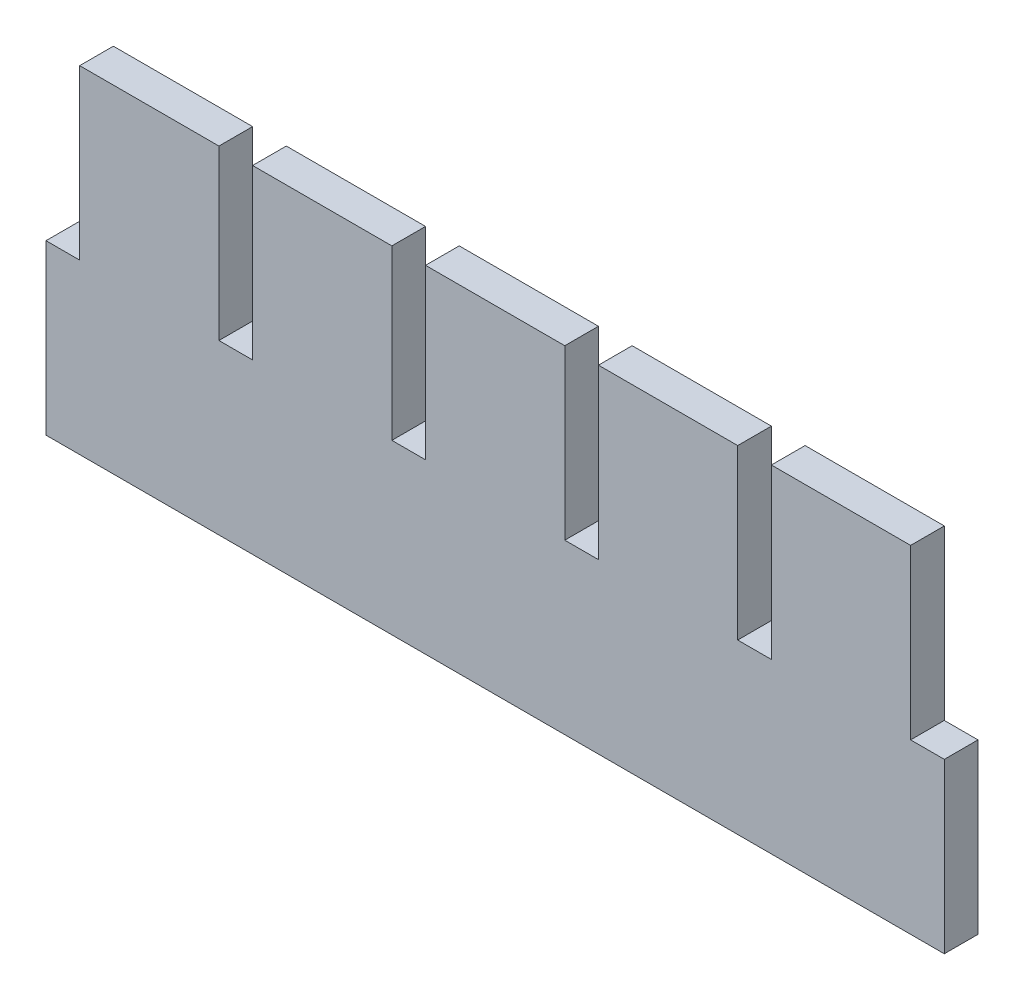
ISO-10303-21;
HEADER;
FILE_DESCRIPTION(('STEP AP214'),'2;1');
FILE_NAME('part.step','',(''),(''),'','','');
FILE_SCHEMA(('AUTOMOTIVE_DESIGN { 1 0 10303 214 1 1 1 1 }'));
ENDSEC;
DATA;
#1=APPLICATION_CONTEXT('core data for automotive mechanical design processes');
#2=APPLICATION_PROTOCOL_DEFINITION('international standard','automotive_design',2000,#1);
#3=PRODUCT_CONTEXT('',#1,'mechanical');
#4=PRODUCT('Part','Part','',(#3));
#5=PRODUCT_RELATED_PRODUCT_CATEGORY('part','',(#4));
#6=PRODUCT_DEFINITION_FORMATION('','',#4);
#7=PRODUCT_DEFINITION_CONTEXT('part definition',#1,'design');
#8=PRODUCT_DEFINITION('design','',#6,#7);
#9=PRODUCT_DEFINITION_SHAPE('','',#8);
#10=(LENGTH_UNIT() NAMED_UNIT(*) SI_UNIT(.MILLI.,.METRE.));
#11=(NAMED_UNIT(*) PLANE_ANGLE_UNIT() SI_UNIT($,.RADIAN.));
#12=(NAMED_UNIT(*) SI_UNIT($,.STERADIAN.) SOLID_ANGLE_UNIT());
#13=UNCERTAINTY_MEASURE_WITH_UNIT(LENGTH_MEASURE(1.E-05),#10,'distance_accuracy_value','');
#14=(GEOMETRIC_REPRESENTATION_CONTEXT(3) GLOBAL_UNCERTAINTY_ASSIGNED_CONTEXT((#13)) GLOBAL_UNIT_ASSIGNED_CONTEXT((#10,
#11,#12)) REPRESENTATION_CONTEXT('',''));
#15=CARTESIAN_POINT('',(0.,0.,0.));
#16=DIRECTION('',(0.,0.,1.));
#17=DIRECTION('',(1.,0.,0.));
#18=AXIS2_PLACEMENT_3D('',#15,#16,#17);
#19=CARTESIAN_POINT('',(0.,0.,3.));
#20=DIRECTION('',(1.,0.,0.));
#21=DIRECTION('',(0.,0.,-1.));
#22=AXIS2_PLACEMENT_3D('',#19,#20,#21);
#23=PLANE('',#22);
#24=DIRECTION('',(0.,-1.,0.));
#25=VECTOR('',#24,1.);
#26=CARTESIAN_POINT('',(0.,0.,0.));
#27=LINE('',#26,#25);
#28=CARTESIAN_POINT('',(0.,15.,0.));
#29=VERTEX_POINT('',#28);
#30=CARTESIAN_POINT('',(0.,0.,0.));
#31=VERTEX_POINT('',#30);
#32=EDGE_CURVE('E409',#29,#31,#27,.T.);
#33=ORIENTED_EDGE('',*,*,#32,.T.);
#34=DIRECTION('',(0.,0.,-1.));
#35=VECTOR('',#34,1.);
#36=CARTESIAN_POINT('',(0.,0.,3.));
#37=LINE('',#36,#35);
#38=CARTESIAN_POINT('',(0.,0.,3.));
#39=VERTEX_POINT('',#38);
#40=EDGE_CURVE('E12',#39,#31,#37,.T.);
#41=ORIENTED_EDGE('',*,*,#40,.F.);
#42=DIRECTION('',(0.,-1.,0.));
#43=VECTOR('',#42,1.);
#44=CARTESIAN_POINT('',(0.,0.,3.));
#45=LINE('',#44,#43);
#46=CARTESIAN_POINT('',(0.,15.,3.));
#47=VERTEX_POINT('',#46);
#48=EDGE_CURVE('E326',#47,#39,#45,.T.);
#49=ORIENTED_EDGE('',*,*,#48,.F.);
#50=DIRECTION('',(0.,0.,-1.));
#51=VECTOR('',#50,1.);
#52=CARTESIAN_POINT('',(0.,15.,3.));
#53=LINE('',#52,#51);
#54=EDGE_CURVE('E225',#47,#29,#53,.T.);
#55=ORIENTED_EDGE('',*,*,#54,.T.);
#56=EDGE_LOOP('',(#33,#41,#49,#55));
#57=FACE_BOUND('',#56,.T.);
#58=ADVANCED_FACE('F34',(#57),#23,.F.);
#59=CARTESIAN_POINT('',(0.,0.,3.));
#60=DIRECTION('',(0.,1.,0.));
#61=DIRECTION('',(0.,0.,1.));
#62=AXIS2_PLACEMENT_3D('',#59,#60,#61);
#63=PLANE('',#62);
#64=DIRECTION('',(1.,0.,0.));
#65=VECTOR('',#64,1.);
#66=CARTESIAN_POINT('',(0.,0.,0.));
#67=LINE('',#66,#65);
#68=CARTESIAN_POINT('',(80.,0.,0.));
#69=VERTEX_POINT('',#68);
#70=EDGE_CURVE('E403',#31,#69,#67,.T.);
#71=ORIENTED_EDGE('',*,*,#70,.T.);
#72=DIRECTION('',(0.,0.,-1.));
#73=VECTOR('',#72,1.);
#74=CARTESIAN_POINT('',(80.,0.,3.));
#75=LINE('',#74,#73);
#76=CARTESIAN_POINT('',(80.,0.,3.));
#77=VERTEX_POINT('',#76);
#78=EDGE_CURVE('E42',#77,#69,#75,.T.);
#79=ORIENTED_EDGE('',*,*,#78,.F.);
#80=DIRECTION('',(1.,0.,0.));
#81=VECTOR('',#80,1.);
#82=CARTESIAN_POINT('',(0.,0.,3.));
#83=LINE('',#82,#81);
#84=EDGE_CURVE('E141',#39,#77,#83,.T.);
#85=ORIENTED_EDGE('',*,*,#84,.F.);
#86=ORIENTED_EDGE('',*,*,#40,.T.);
#87=EDGE_LOOP('',(#71,#79,#85,#86));
#88=FACE_BOUND('',#87,.T.);
#89=ADVANCED_FACE('F462',(#88),#63,.F.);
#90=CARTESIAN_POINT('',(80.,0.,3.));
#91=DIRECTION('',(-1.,0.,0.));
#92=DIRECTION('',(0.,-1.,0.));
#93=AXIS2_PLACEMENT_3D('',#90,#91,#92);
#94=PLANE('',#93);
#95=DIRECTION('',(0.,1.,0.));
#96=VECTOR('',#95,1.);
#97=CARTESIAN_POINT('',(80.,0.,0.));
#98=LINE('',#97,#96);
#99=CARTESIAN_POINT('',(79.9999999999999,15.,0.));
#100=VERTEX_POINT('',#99);
#101=EDGE_CURVE('E398',#69,#100,#98,.T.);
#102=ORIENTED_EDGE('',*,*,#101,.T.);
#103=DIRECTION('',(0.,0.,-1.));
#104=VECTOR('',#103,1.);
#105=CARTESIAN_POINT('',(79.9999999999999,15.,3.));
#106=LINE('',#105,#104);
#107=CARTESIAN_POINT('',(79.9999999999999,15.,3.));
#108=VERTEX_POINT('',#107);
#109=EDGE_CURVE('E390',#108,#100,#106,.T.);
#110=ORIENTED_EDGE('',*,*,#109,.F.);
#111=DIRECTION('',(0.,1.,0.));
#112=VECTOR('',#111,1.);
#113=CARTESIAN_POINT('',(80.,0.,3.));
#114=LINE('',#113,#112);
#115=EDGE_CURVE('E318',#77,#108,#114,.T.);
#116=ORIENTED_EDGE('',*,*,#115,.F.);
#117=ORIENTED_EDGE('',*,*,#78,.T.);
#118=EDGE_LOOP('',(#102,#110,#116,#117));
#119=FACE_BOUND('',#118,.T.);
#120=ADVANCED_FACE('F396',(#119),#94,.F.);
#121=CARTESIAN_POINT('',(79.9999999999999,15.,3.));
#122=DIRECTION('',(0.,-1.,0.));
#123=DIRECTION('',(0.,0.,-1.));
#124=AXIS2_PLACEMENT_3D('',#121,#122,#123);
#125=PLANE('',#124);
#126=DIRECTION('',(-1.,0.,0.));
#127=VECTOR('',#126,1.);
#128=CARTESIAN_POINT('',(79.9999999999999,15.,0.));
#129=LINE('',#128,#127);
#130=CARTESIAN_POINT('',(76.9999999999999,15.,0.));
#131=VERTEX_POINT('',#130);
#132=EDGE_CURVE('E405',#100,#131,#129,.T.);
#133=ORIENTED_EDGE('',*,*,#132,.T.);
#134=DIRECTION('',(0.,0.,-1.));
#135=VECTOR('',#134,1.);
#136=CARTESIAN_POINT('',(76.9999999999999,15.,3.));
#137=LINE('',#136,#135);
#138=CARTESIAN_POINT('',(76.9999999999999,15.,3.));
#139=VERTEX_POINT('',#138);
#140=EDGE_CURVE('E387',#139,#131,#137,.T.);
#141=ORIENTED_EDGE('',*,*,#140,.F.);
#142=DIRECTION('',(-1.,0.,0.));
#143=VECTOR('',#142,1.);
#144=CARTESIAN_POINT('',(79.9999999999999,15.,3.));
#145=LINE('',#144,#143);
#146=EDGE_CURVE('E314',#108,#139,#145,.T.);
#147=ORIENTED_EDGE('',*,*,#146,.F.);
#148=ORIENTED_EDGE('',*,*,#109,.T.);
#149=EDGE_LOOP('',(#133,#141,#147,#148));
#150=FACE_BOUND('',#149,.T.);
#151=ADVANCED_FACE('F469',(#150),#125,.F.);
#152=CARTESIAN_POINT('',(77.,30.,3.));
#153=DIRECTION('',(-1.,0.,0.));
#154=DIRECTION('',(0.,-1.,0.));
#155=AXIS2_PLACEMENT_3D('',#152,#153,#154);
#156=PLANE('',#155);
#157=DIRECTION('',(0.,1.,0.));
#158=VECTOR('',#157,1.);
#159=CARTESIAN_POINT('',(77.,30.,0.));
#160=LINE('',#159,#158);
#161=CARTESIAN_POINT('',(77.,30.,0.));
#162=VERTEX_POINT('',#161);
#163=EDGE_CURVE('E407',#131,#162,#160,.T.);
#164=ORIENTED_EDGE('',*,*,#163,.T.);
#165=DIRECTION('',(0.,0.,-1.));
#166=VECTOR('',#165,1.);
#167=CARTESIAN_POINT('',(77.,30.,3.));
#168=LINE('',#167,#166);
#169=CARTESIAN_POINT('',(77.,30.,3.));
#170=VERTEX_POINT('',#169);
#171=EDGE_CURVE('E384',#170,#162,#168,.T.);
#172=ORIENTED_EDGE('',*,*,#171,.F.);
#173=DIRECTION('',(0.,1.,0.));
#174=VECTOR('',#173,1.);
#175=CARTESIAN_POINT('',(77.,30.,3.));
#176=LINE('',#175,#174);
#177=EDGE_CURVE('E311',#139,#170,#176,.T.);
#178=ORIENTED_EDGE('',*,*,#177,.F.);
#179=ORIENTED_EDGE('',*,*,#140,.T.);
#180=EDGE_LOOP('',(#164,#172,#178,#179));
#181=FACE_BOUND('',#180,.T.);
#182=ADVANCED_FACE('F474',(#181),#156,.F.);
#183=CARTESIAN_POINT('',(64.6,30.,3.));
#184=DIRECTION('',(0.,-1.,0.));
#185=DIRECTION('',(0.,0.,-1.));
#186=AXIS2_PLACEMENT_3D('',#183,#184,#185);
#187=PLANE('',#186);
#188=DIRECTION('',(-1.,0.,0.));
#189=VECTOR('',#188,1.);
#190=CARTESIAN_POINT('',(64.6,30.,0.));
#191=LINE('',#190,#189);
#192=CARTESIAN_POINT('',(64.6,30.,0.));
#193=VERTEX_POINT('',#192);
#194=EDGE_CURVE('E413',#162,#193,#191,.T.);
#195=ORIENTED_EDGE('',*,*,#194,.T.);
#196=DIRECTION('',(0.,0.,-1.));
#197=VECTOR('',#196,1.);
#198=CARTESIAN_POINT('',(64.6,30.,3.));
#199=LINE('',#198,#197);
#200=CARTESIAN_POINT('',(64.6,30.,3.));
#201=VERTEX_POINT('',#200);
#202=EDGE_CURVE('E381',#201,#193,#199,.T.);
#203=ORIENTED_EDGE('',*,*,#202,.F.);
#204=DIRECTION('',(-1.,0.,0.));
#205=VECTOR('',#204,1.);
#206=CARTESIAN_POINT('',(64.6,30.,3.));
#207=LINE('',#206,#205);
#208=EDGE_CURVE('E303',#170,#201,#207,.T.);
#209=ORIENTED_EDGE('',*,*,#208,.F.);
#210=ORIENTED_EDGE('',*,*,#171,.T.);
#211=EDGE_LOOP('',(#195,#203,#209,#210));
#212=FACE_BOUND('',#211,.T.);
#213=ADVANCED_FACE('F478',(#212),#187,.F.);
#214=CARTESIAN_POINT('',(64.6,30.,3.));
#215=DIRECTION('',(1.,0.,0.));
#216=DIRECTION('',(0.,1.,0.));
#217=AXIS2_PLACEMENT_3D('',#214,#215,#216);
#218=PLANE('',#217);
#219=DIRECTION('',(0.,-1.,0.));
#220=VECTOR('',#219,1.);
#221=CARTESIAN_POINT('',(64.6,30.,0.));
#222=LINE('',#221,#220);
#223=CARTESIAN_POINT('',(64.5999999999999,15.,0.));
#224=VERTEX_POINT('',#223);
#225=EDGE_CURVE('E415',#193,#224,#222,.T.);
#226=ORIENTED_EDGE('',*,*,#225,.T.);
#227=DIRECTION('',(0.,0.,-1.));
#228=VECTOR('',#227,1.);
#229=CARTESIAN_POINT('',(64.5999999999999,15.,3.));
#230=LINE('',#229,#228);
#231=CARTESIAN_POINT('',(64.5999999999999,15.,3.));
#232=VERTEX_POINT('',#231);
#233=EDGE_CURVE('E378',#232,#224,#230,.T.);
#234=ORIENTED_EDGE('',*,*,#233,.F.);
#235=DIRECTION('',(0.,-1.,0.));
#236=VECTOR('',#235,1.);
#237=CARTESIAN_POINT('',(64.6,30.,3.));
#238=LINE('',#237,#236);
#239=EDGE_CURVE('E299',#201,#232,#238,.T.);
#240=ORIENTED_EDGE('',*,*,#239,.F.);
#241=ORIENTED_EDGE('',*,*,#202,.T.);
#242=EDGE_LOOP('',(#226,#234,#240,#241));
#243=FACE_BOUND('',#242,.T.);
#244=ADVANCED_FACE('F482',(#243),#218,.F.);
#245=CARTESIAN_POINT('',(61.5999999999999,15.,3.));
#246=DIRECTION('',(0.,-1.,0.));
#247=DIRECTION('',(0.,0.,-1.));
#248=AXIS2_PLACEMENT_3D('',#245,#246,#247);
#249=PLANE('',#248);
#250=DIRECTION('',(-1.,0.,0.));
#251=VECTOR('',#250,1.);
#252=CARTESIAN_POINT('',(61.5999999999999,15.,0.));
#253=LINE('',#252,#251);
#254=CARTESIAN_POINT('',(61.5999999999999,15.,0.));
#255=VERTEX_POINT('',#254);
#256=EDGE_CURVE('E417',#224,#255,#253,.T.);
#257=ORIENTED_EDGE('',*,*,#256,.T.);
#258=DIRECTION('',(0.,0.,-1.));
#259=VECTOR('',#258,1.);
#260=CARTESIAN_POINT('',(61.5999999999999,15.,3.));
#261=LINE('',#260,#259);
#262=CARTESIAN_POINT('',(61.5999999999999,15.,3.));
#263=VERTEX_POINT('',#262);
#264=EDGE_CURVE('E375',#263,#255,#261,.T.);
#265=ORIENTED_EDGE('',*,*,#264,.F.);
#266=DIRECTION('',(-1.,0.,0.));
#267=VECTOR('',#266,1.);
#268=CARTESIAN_POINT('',(61.5999999999999,15.,3.));
#269=LINE('',#268,#267);
#270=EDGE_CURVE('E295',#232,#263,#269,.T.);
#271=ORIENTED_EDGE('',*,*,#270,.F.);
#272=ORIENTED_EDGE('',*,*,#233,.T.);
#273=EDGE_LOOP('',(#257,#265,#271,#272));
#274=FACE_BOUND('',#273,.T.);
#275=ADVANCED_FACE('F486',(#274),#249,.F.);
#276=CARTESIAN_POINT('',(61.6,30.,3.));
#277=DIRECTION('',(-1.,0.,0.));
#278=DIRECTION('',(0.,-1.,0.));
#279=AXIS2_PLACEMENT_3D('',#276,#277,#278);
#280=PLANE('',#279);
#281=DIRECTION('',(0.,1.,0.));
#282=VECTOR('',#281,1.);
#283=CARTESIAN_POINT('',(61.6,30.,0.));
#284=LINE('',#283,#282);
#285=CARTESIAN_POINT('',(61.6,30.,0.));
#286=VERTEX_POINT('',#285);
#287=EDGE_CURVE('E419',#255,#286,#284,.T.);
#288=ORIENTED_EDGE('',*,*,#287,.T.);
#289=DIRECTION('',(0.,0.,-1.));
#290=VECTOR('',#289,1.);
#291=CARTESIAN_POINT('',(61.6,30.,3.));
#292=LINE('',#291,#290);
#293=CARTESIAN_POINT('',(61.6,30.,3.));
#294=VERTEX_POINT('',#293);
#295=EDGE_CURVE('E372',#294,#286,#292,.T.);
#296=ORIENTED_EDGE('',*,*,#295,.F.);
#297=DIRECTION('',(0.,1.,0.));
#298=VECTOR('',#297,1.);
#299=CARTESIAN_POINT('',(61.6,30.,3.));
#300=LINE('',#299,#298);
#301=EDGE_CURVE('E292',#263,#294,#300,.T.);
#302=ORIENTED_EDGE('',*,*,#301,.F.);
#303=ORIENTED_EDGE('',*,*,#264,.T.);
#304=EDGE_LOOP('',(#288,#296,#302,#303));
#305=FACE_BOUND('',#304,.T.);
#306=ADVANCED_FACE('F490',(#305),#280,.F.);
#307=CARTESIAN_POINT('',(49.2,30.,3.));
#308=DIRECTION('',(0.,-1.,0.));
#309=DIRECTION('',(0.,0.,-1.));
#310=AXIS2_PLACEMENT_3D('',#307,#308,#309);
#311=PLANE('',#310);
#312=DIRECTION('',(-1.,0.,0.));
#313=VECTOR('',#312,1.);
#314=CARTESIAN_POINT('',(49.2,30.,0.));
#315=LINE('',#314,#313);
#316=CARTESIAN_POINT('',(49.2,30.,0.));
#317=VERTEX_POINT('',#316);
#318=EDGE_CURVE('E421',#286,#317,#315,.T.);
#319=ORIENTED_EDGE('',*,*,#318,.T.);
#320=DIRECTION('',(0.,0.,-1.));
#321=VECTOR('',#320,1.);
#322=CARTESIAN_POINT('',(49.2,30.,3.));
#323=LINE('',#322,#321);
#324=CARTESIAN_POINT('',(49.2,30.,3.));
#325=VERTEX_POINT('',#324);
#326=EDGE_CURVE('E369',#325,#317,#323,.T.);
#327=ORIENTED_EDGE('',*,*,#326,.F.);
#328=DIRECTION('',(-1.,0.,0.));
#329=VECTOR('',#328,1.);
#330=CARTESIAN_POINT('',(49.2,30.,3.));
#331=LINE('',#330,#329);
#332=EDGE_CURVE('E284',#294,#325,#331,.T.);
#333=ORIENTED_EDGE('',*,*,#332,.F.);
#334=ORIENTED_EDGE('',*,*,#295,.T.);
#335=EDGE_LOOP('',(#319,#327,#333,#334));
#336=FACE_BOUND('',#335,.T.);
#337=ADVANCED_FACE('F494',(#336),#311,.F.);
#338=CARTESIAN_POINT('',(49.2,30.,3.));
#339=DIRECTION('',(1.,0.,0.));
#340=DIRECTION('',(0.,1.,0.));
#341=AXIS2_PLACEMENT_3D('',#338,#339,#340);
#342=PLANE('',#341);
#343=DIRECTION('',(0.,-1.,0.));
#344=VECTOR('',#343,1.);
#345=CARTESIAN_POINT('',(49.2,30.,0.));
#346=LINE('',#345,#344);
#347=CARTESIAN_POINT('',(49.2,15.,0.));
#348=VERTEX_POINT('',#347);
#349=EDGE_CURVE('E423',#317,#348,#346,.T.);
#350=ORIENTED_EDGE('',*,*,#349,.T.);
#351=DIRECTION('',(0.,0.,-1.));
#352=VECTOR('',#351,1.);
#353=CARTESIAN_POINT('',(49.2,15.,3.));
#354=LINE('',#353,#352);
#355=CARTESIAN_POINT('',(49.2,15.,3.));
#356=VERTEX_POINT('',#355);
#357=EDGE_CURVE('E366',#356,#348,#354,.T.);
#358=ORIENTED_EDGE('',*,*,#357,.F.);
#359=DIRECTION('',(0.,-1.,0.));
#360=VECTOR('',#359,1.);
#361=CARTESIAN_POINT('',(49.2,30.,3.));
#362=LINE('',#361,#360);
#363=EDGE_CURVE('E280',#325,#356,#362,.T.);
#364=ORIENTED_EDGE('',*,*,#363,.F.);
#365=ORIENTED_EDGE('',*,*,#326,.T.);
#366=EDGE_LOOP('',(#350,#358,#364,#365));
#367=FACE_BOUND('',#366,.T.);
#368=ADVANCED_FACE('F498',(#367),#342,.F.);
#369=CARTESIAN_POINT('',(46.1999999999999,15.,3.));
#370=DIRECTION('',(0.,-1.,0.));
#371=DIRECTION('',(0.,0.,-1.));
#372=AXIS2_PLACEMENT_3D('',#369,#370,#371);
#373=PLANE('',#372);
#374=DIRECTION('',(-1.,0.,0.));
#375=VECTOR('',#374,1.);
#376=CARTESIAN_POINT('',(46.1999999999999,15.,0.));
#377=LINE('',#376,#375);
#378=CARTESIAN_POINT('',(46.1999999999999,15.,0.));
#379=VERTEX_POINT('',#378);
#380=EDGE_CURVE('E425',#348,#379,#377,.T.);
#381=ORIENTED_EDGE('',*,*,#380,.T.);
#382=DIRECTION('',(0.,0.,-1.));
#383=VECTOR('',#382,1.);
#384=CARTESIAN_POINT('',(46.1999999999999,15.,3.));
#385=LINE('',#384,#383);
#386=CARTESIAN_POINT('',(46.1999999999999,15.,3.));
#387=VERTEX_POINT('',#386);
#388=EDGE_CURVE('E363',#387,#379,#385,.T.);
#389=ORIENTED_EDGE('',*,*,#388,.F.);
#390=DIRECTION('',(-1.,0.,0.));
#391=VECTOR('',#390,1.);
#392=CARTESIAN_POINT('',(46.1999999999999,15.,3.));
#393=LINE('',#392,#391);
#394=EDGE_CURVE('E276',#356,#387,#393,.T.);
#395=ORIENTED_EDGE('',*,*,#394,.F.);
#396=ORIENTED_EDGE('',*,*,#357,.T.);
#397=EDGE_LOOP('',(#381,#389,#395,#396));
#398=FACE_BOUND('',#397,.T.);
#399=ADVANCED_FACE('F502',(#398),#373,.F.);
#400=CARTESIAN_POINT('',(46.2,30.,3.));
#401=DIRECTION('',(-1.,0.,0.));
#402=DIRECTION('',(0.,-1.,0.));
#403=AXIS2_PLACEMENT_3D('',#400,#401,#402);
#404=PLANE('',#403);
#405=DIRECTION('',(0.,1.,0.));
#406=VECTOR('',#405,1.);
#407=CARTESIAN_POINT('',(46.2,30.,0.));
#408=LINE('',#407,#406);
#409=CARTESIAN_POINT('',(46.2,30.,0.));
#410=VERTEX_POINT('',#409);
#411=EDGE_CURVE('E427',#379,#410,#408,.T.);
#412=ORIENTED_EDGE('',*,*,#411,.T.);
#413=DIRECTION('',(0.,0.,-1.));
#414=VECTOR('',#413,1.);
#415=CARTESIAN_POINT('',(46.2,30.,3.));
#416=LINE('',#415,#414);
#417=CARTESIAN_POINT('',(46.2,30.,3.));
#418=VERTEX_POINT('',#417);
#419=EDGE_CURVE('E360',#418,#410,#416,.T.);
#420=ORIENTED_EDGE('',*,*,#419,.F.);
#421=DIRECTION('',(0.,1.,0.));
#422=VECTOR('',#421,1.);
#423=CARTESIAN_POINT('',(46.2,30.,3.));
#424=LINE('',#423,#422);
#425=EDGE_CURVE('E273',#387,#418,#424,.T.);
#426=ORIENTED_EDGE('',*,*,#425,.F.);
#427=ORIENTED_EDGE('',*,*,#388,.T.);
#428=EDGE_LOOP('',(#412,#420,#426,#427));
#429=FACE_BOUND('',#428,.T.);
#430=ADVANCED_FACE('F506',(#429),#404,.F.);
#431=CARTESIAN_POINT('',(33.8,30.,3.));
#432=DIRECTION('',(0.,-1.,0.));
#433=DIRECTION('',(0.,0.,-1.));
#434=AXIS2_PLACEMENT_3D('',#431,#432,#433);
#435=PLANE('',#434);
#436=DIRECTION('',(-1.,0.,0.));
#437=VECTOR('',#436,1.);
#438=CARTESIAN_POINT('',(33.8,30.,0.));
#439=LINE('',#438,#437);
#440=CARTESIAN_POINT('',(33.8,30.,0.));
#441=VERTEX_POINT('',#440);
#442=EDGE_CURVE('E429',#410,#441,#439,.T.);
#443=ORIENTED_EDGE('',*,*,#442,.T.);
#444=DIRECTION('',(0.,0.,-1.));
#445=VECTOR('',#444,1.);
#446=CARTESIAN_POINT('',(33.8,30.,3.));
#447=LINE('',#446,#445);
#448=CARTESIAN_POINT('',(33.8,30.,3.));
#449=VERTEX_POINT('',#448);
#450=EDGE_CURVE('E357',#449,#441,#447,.T.);
#451=ORIENTED_EDGE('',*,*,#450,.F.);
#452=DIRECTION('',(-1.,0.,0.));
#453=VECTOR('',#452,1.);
#454=CARTESIAN_POINT('',(33.8,30.,3.));
#455=LINE('',#454,#453);
#456=EDGE_CURVE('E265',#418,#449,#455,.T.);
#457=ORIENTED_EDGE('',*,*,#456,.F.);
#458=ORIENTED_EDGE('',*,*,#419,.T.);
#459=EDGE_LOOP('',(#443,#451,#457,#458));
#460=FACE_BOUND('',#459,.T.);
#461=ADVANCED_FACE('F510',(#460),#435,.F.);
#462=CARTESIAN_POINT('',(33.8,30.,3.));
#463=DIRECTION('',(1.,0.,0.));
#464=DIRECTION('',(0.,1.,0.));
#465=AXIS2_PLACEMENT_3D('',#462,#463,#464);
#466=PLANE('',#465);
#467=DIRECTION('',(0.,-1.,0.));
#468=VECTOR('',#467,1.);
#469=CARTESIAN_POINT('',(33.8,30.,0.));
#470=LINE('',#469,#468);
#471=CARTESIAN_POINT('',(33.8,15.,0.));
#472=VERTEX_POINT('',#471);
#473=EDGE_CURVE('E431',#441,#472,#470,.T.);
#474=ORIENTED_EDGE('',*,*,#473,.T.);
#475=DIRECTION('',(0.,0.,-1.));
#476=VECTOR('',#475,1.);
#477=CARTESIAN_POINT('',(33.8,15.,3.));
#478=LINE('',#477,#476);
#479=CARTESIAN_POINT('',(33.8,15.,3.));
#480=VERTEX_POINT('',#479);
#481=EDGE_CURVE('E354',#480,#472,#478,.T.);
#482=ORIENTED_EDGE('',*,*,#481,.F.);
#483=DIRECTION('',(0.,-1.,0.));
#484=VECTOR('',#483,1.);
#485=CARTESIAN_POINT('',(33.8,30.,3.));
#486=LINE('',#485,#484);
#487=EDGE_CURVE('E261',#449,#480,#486,.T.);
#488=ORIENTED_EDGE('',*,*,#487,.F.);
#489=ORIENTED_EDGE('',*,*,#450,.T.);
#490=EDGE_LOOP('',(#474,#482,#488,#489));
#491=FACE_BOUND('',#490,.T.);
#492=ADVANCED_FACE('F514',(#491),#466,.F.);
#493=CARTESIAN_POINT('',(30.8,15.,3.));
#494=DIRECTION('',(0.,-1.,0.));
#495=DIRECTION('',(0.,0.,-1.));
#496=AXIS2_PLACEMENT_3D('',#493,#494,#495);
#497=PLANE('',#496);
#498=DIRECTION('',(-1.,0.,0.));
#499=VECTOR('',#498,1.);
#500=CARTESIAN_POINT('',(30.8,15.,0.));
#501=LINE('',#500,#499);
#502=CARTESIAN_POINT('',(30.8,15.,0.));
#503=VERTEX_POINT('',#502);
#504=EDGE_CURVE('E433',#472,#503,#501,.T.);
#505=ORIENTED_EDGE('',*,*,#504,.T.);
#506=DIRECTION('',(0.,0.,-1.));
#507=VECTOR('',#506,1.);
#508=CARTESIAN_POINT('',(30.8,15.,3.));
#509=LINE('',#508,#507);
#510=CARTESIAN_POINT('',(30.8,15.,3.));
#511=VERTEX_POINT('',#510);
#512=EDGE_CURVE('E351',#511,#503,#509,.T.);
#513=ORIENTED_EDGE('',*,*,#512,.F.);
#514=DIRECTION('',(-1.,0.,0.));
#515=VECTOR('',#514,1.);
#516=CARTESIAN_POINT('',(30.8,15.,3.));
#517=LINE('',#516,#515);
#518=EDGE_CURVE('E257',#480,#511,#517,.T.);
#519=ORIENTED_EDGE('',*,*,#518,.F.);
#520=ORIENTED_EDGE('',*,*,#481,.T.);
#521=EDGE_LOOP('',(#505,#513,#519,#520));
#522=FACE_BOUND('',#521,.T.);
#523=ADVANCED_FACE('F518',(#522),#497,.F.);
#524=CARTESIAN_POINT('',(30.8,30.,3.));
#525=DIRECTION('',(-1.,0.,0.));
#526=DIRECTION('',(0.,-1.,0.));
#527=AXIS2_PLACEMENT_3D('',#524,#525,#526);
#528=PLANE('',#527);
#529=DIRECTION('',(0.,1.,0.));
#530=VECTOR('',#529,1.);
#531=CARTESIAN_POINT('',(30.8,30.,0.));
#532=LINE('',#531,#530);
#533=CARTESIAN_POINT('',(30.8,30.,0.));
#534=VERTEX_POINT('',#533);
#535=EDGE_CURVE('E435',#503,#534,#532,.T.);
#536=ORIENTED_EDGE('',*,*,#535,.T.);
#537=DIRECTION('',(0.,0.,-1.));
#538=VECTOR('',#537,1.);
#539=CARTESIAN_POINT('',(30.8,30.,3.));
#540=LINE('',#539,#538);
#541=CARTESIAN_POINT('',(30.8,30.,3.));
#542=VERTEX_POINT('',#541);
#543=EDGE_CURVE('E348',#542,#534,#540,.T.);
#544=ORIENTED_EDGE('',*,*,#543,.F.);
#545=DIRECTION('',(0.,1.,0.));
#546=VECTOR('',#545,1.);
#547=CARTESIAN_POINT('',(30.8,30.,3.));
#548=LINE('',#547,#546);
#549=EDGE_CURVE('E254',#511,#542,#548,.T.);
#550=ORIENTED_EDGE('',*,*,#549,.F.);
#551=ORIENTED_EDGE('',*,*,#512,.T.);
#552=EDGE_LOOP('',(#536,#544,#550,#551));
#553=FACE_BOUND('',#552,.T.);
#554=ADVANCED_FACE('F522',(#553),#528,.F.);
#555=CARTESIAN_POINT('',(18.4,30.,3.));
#556=DIRECTION('',(0.,-1.,0.));
#557=DIRECTION('',(0.,0.,-1.));
#558=AXIS2_PLACEMENT_3D('',#555,#556,#557);
#559=PLANE('',#558);
#560=DIRECTION('',(-1.,0.,0.));
#561=VECTOR('',#560,1.);
#562=CARTESIAN_POINT('',(18.4,30.,0.));
#563=LINE('',#562,#561);
#564=CARTESIAN_POINT('',(18.4,30.,0.));
#565=VERTEX_POINT('',#564);
#566=EDGE_CURVE('E437',#534,#565,#563,.T.);
#567=ORIENTED_EDGE('',*,*,#566,.T.);
#568=DIRECTION('',(0.,0.,-1.));
#569=VECTOR('',#568,1.);
#570=CARTESIAN_POINT('',(18.4,30.,3.));
#571=LINE('',#570,#569);
#572=CARTESIAN_POINT('',(18.4,30.,3.));
#573=VERTEX_POINT('',#572);
#574=EDGE_CURVE('E345',#573,#565,#571,.T.);
#575=ORIENTED_EDGE('',*,*,#574,.F.);
#576=DIRECTION('',(-1.,0.,0.));
#577=VECTOR('',#576,1.);
#578=CARTESIAN_POINT('',(18.4,30.,3.));
#579=LINE('',#578,#577);
#580=EDGE_CURVE('E246',#542,#573,#579,.T.);
#581=ORIENTED_EDGE('',*,*,#580,.F.);
#582=ORIENTED_EDGE('',*,*,#543,.T.);
#583=EDGE_LOOP('',(#567,#575,#581,#582));
#584=FACE_BOUND('',#583,.T.);
#585=ADVANCED_FACE('F526',(#584),#559,.F.);
#586=CARTESIAN_POINT('',(18.4,30.,3.));
#587=DIRECTION('',(1.,0.,0.));
#588=DIRECTION('',(0.,0.,-1.));
#589=AXIS2_PLACEMENT_3D('',#586,#587,#588);
#590=PLANE('',#589);
#591=DIRECTION('',(0.,-1.,0.));
#592=VECTOR('',#591,1.);
#593=CARTESIAN_POINT('',(18.4,30.,0.));
#594=LINE('',#593,#592);
#595=CARTESIAN_POINT('',(18.4,15.,0.));
#596=VERTEX_POINT('',#595);
#597=EDGE_CURVE('E439',#565,#596,#594,.T.);
#598=ORIENTED_EDGE('',*,*,#597,.T.);
#599=DIRECTION('',(0.,0.,-1.));
#600=VECTOR('',#599,1.);
#601=CARTESIAN_POINT('',(18.4,15.,3.));
#602=LINE('',#601,#600);
#603=CARTESIAN_POINT('',(18.4,15.,3.));
#604=VERTEX_POINT('',#603);
#605=EDGE_CURVE('E342',#604,#596,#602,.T.);
#606=ORIENTED_EDGE('',*,*,#605,.F.);
#607=DIRECTION('',(0.,-1.,0.));
#608=VECTOR('',#607,1.);
#609=CARTESIAN_POINT('',(18.4,30.,3.));
#610=LINE('',#609,#608);
#611=EDGE_CURVE('E242',#573,#604,#610,.T.);
#612=ORIENTED_EDGE('',*,*,#611,.F.);
#613=ORIENTED_EDGE('',*,*,#574,.T.);
#614=EDGE_LOOP('',(#598,#606,#612,#613));
#615=FACE_BOUND('',#614,.T.);
#616=ADVANCED_FACE('F530',(#615),#590,.F.);
#617=CARTESIAN_POINT('',(15.4,15.,3.));
#618=DIRECTION('',(0.,-1.,0.));
#619=DIRECTION('',(0.,0.,-1.));
#620=AXIS2_PLACEMENT_3D('',#617,#618,#619);
#621=PLANE('',#620);
#622=DIRECTION('',(-1.,0.,0.));
#623=VECTOR('',#622,1.);
#624=CARTESIAN_POINT('',(15.4,15.,0.));
#625=LINE('',#624,#623);
#626=CARTESIAN_POINT('',(15.4,15.,0.));
#627=VERTEX_POINT('',#626);
#628=EDGE_CURVE('E441',#596,#627,#625,.T.);
#629=ORIENTED_EDGE('',*,*,#628,.T.);
#630=DIRECTION('',(0.,0.,-1.));
#631=VECTOR('',#630,1.);
#632=CARTESIAN_POINT('',(15.4,15.,3.));
#633=LINE('',#632,#631);
#634=CARTESIAN_POINT('',(15.4,15.,3.));
#635=VERTEX_POINT('',#634);
#636=EDGE_CURVE('E339',#635,#627,#633,.T.);
#637=ORIENTED_EDGE('',*,*,#636,.F.);
#638=DIRECTION('',(-1.,0.,0.));
#639=VECTOR('',#638,1.);
#640=CARTESIAN_POINT('',(15.4,15.,3.));
#641=LINE('',#640,#639);
#642=EDGE_CURVE('E238',#604,#635,#641,.T.);
#643=ORIENTED_EDGE('',*,*,#642,.F.);
#644=ORIENTED_EDGE('',*,*,#605,.T.);
#645=EDGE_LOOP('',(#629,#637,#643,#644));
#646=FACE_BOUND('',#645,.T.);
#647=ADVANCED_FACE('F534',(#646),#621,.F.);
#648=CARTESIAN_POINT('',(15.4,30.,3.));
#649=DIRECTION('',(-1.,0.,0.));
#650=DIRECTION('',(0.,-1.,0.));
#651=AXIS2_PLACEMENT_3D('',#648,#649,#650);
#652=PLANE('',#651);
#653=DIRECTION('',(0.,1.,0.));
#654=VECTOR('',#653,1.);
#655=CARTESIAN_POINT('',(15.4,30.,0.));
#656=LINE('',#655,#654);
#657=CARTESIAN_POINT('',(15.4,30.,0.));
#658=VERTEX_POINT('',#657);
#659=EDGE_CURVE('E443',#627,#658,#656,.T.);
#660=ORIENTED_EDGE('',*,*,#659,.T.);
#661=DIRECTION('',(0.,0.,-1.));
#662=VECTOR('',#661,1.);
#663=CARTESIAN_POINT('',(15.4,30.,3.));
#664=LINE('',#663,#662);
#665=CARTESIAN_POINT('',(15.4,30.,3.));
#666=VERTEX_POINT('',#665);
#667=EDGE_CURVE('E218',#666,#658,#664,.T.);
#668=ORIENTED_EDGE('',*,*,#667,.F.);
#669=DIRECTION('',(0.,1.,0.));
#670=VECTOR('',#669,1.);
#671=CARTESIAN_POINT('',(15.4,30.,3.));
#672=LINE('',#671,#670);
#673=EDGE_CURVE('E208',#635,#666,#672,.T.);
#674=ORIENTED_EDGE('',*,*,#673,.F.);
#675=ORIENTED_EDGE('',*,*,#636,.T.);
#676=EDGE_LOOP('',(#660,#668,#674,#675));
#677=FACE_BOUND('',#676,.T.);
#678=ADVANCED_FACE('F446',(#677),#652,.F.);
#679=CARTESIAN_POINT('',(3.,30.,3.));
#680=DIRECTION('',(0.,-1.,0.));
#681=DIRECTION('',(0.,0.,-1.));
#682=AXIS2_PLACEMENT_3D('',#679,#680,#681);
#683=PLANE('',#682);
#684=DIRECTION('',(-1.,0.,0.));
#685=VECTOR('',#684,1.);
#686=CARTESIAN_POINT('',(3.,30.,0.));
#687=LINE('',#686,#685);
#688=CARTESIAN_POINT('',(3.,30.,0.));
#689=VERTEX_POINT('',#688);
#690=EDGE_CURVE('E217',#658,#689,#687,.T.);
#691=ORIENTED_EDGE('',*,*,#690,.T.);
#692=DIRECTION('',(0.,0.,-1.));
#693=VECTOR('',#692,1.);
#694=CARTESIAN_POINT('',(3.,30.,3.));
#695=LINE('',#694,#693);
#696=CARTESIAN_POINT('',(3.,30.,3.));
#697=VERTEX_POINT('',#696);
#698=EDGE_CURVE('E214',#697,#689,#695,.T.);
#699=ORIENTED_EDGE('',*,*,#698,.F.);
#700=DIRECTION('',(-1.,0.,0.));
#701=VECTOR('',#700,1.);
#702=CARTESIAN_POINT('',(3.,30.,3.));
#703=LINE('',#702,#701);
#704=EDGE_CURVE('E202',#666,#697,#703,.T.);
#705=ORIENTED_EDGE('',*,*,#704,.F.);
#706=ORIENTED_EDGE('',*,*,#667,.T.);
#707=EDGE_LOOP('',(#691,#699,#705,#706));
#708=FACE_BOUND('',#707,.T.);
#709=ADVANCED_FACE('F215',(#708),#683,.F.);
#710=CARTESIAN_POINT('',(3.,30.,3.));
#711=DIRECTION('',(1.,0.,0.));
#712=DIRECTION('',(0.,1.,0.));
#713=AXIS2_PLACEMENT_3D('',#710,#711,#712);
#714=PLANE('',#713);
#715=DIRECTION('',(0.,-1.,0.));
#716=VECTOR('',#715,1.);
#717=CARTESIAN_POINT('',(3.,30.,0.));
#718=LINE('',#717,#716);
#719=CARTESIAN_POINT('',(3.,15.,0.));
#720=VERTEX_POINT('',#719);
#721=EDGE_CURVE('E127',#689,#720,#718,.T.);
#722=ORIENTED_EDGE('',*,*,#721,.T.);
#723=DIRECTION('',(0.,0.,-1.));
#724=VECTOR('',#723,1.);
#725=CARTESIAN_POINT('',(3.,15.,3.));
#726=LINE('',#725,#724);
#727=CARTESIAN_POINT('',(3.,15.,3.));
#728=VERTEX_POINT('',#727);
#729=EDGE_CURVE('E219',#728,#720,#726,.T.);
#730=ORIENTED_EDGE('',*,*,#729,.F.);
#731=DIRECTION('',(0.,-1.,0.));
#732=VECTOR('',#731,1.);
#733=CARTESIAN_POINT('',(3.,30.,3.));
#734=LINE('',#733,#732);
#735=EDGE_CURVE('E206',#697,#728,#734,.T.);
#736=ORIENTED_EDGE('',*,*,#735,.F.);
#737=ORIENTED_EDGE('',*,*,#698,.T.);
#738=EDGE_LOOP('',(#722,#730,#736,#737));
#739=FACE_BOUND('',#738,.T.);
#740=ADVANCED_FACE('F221',(#739),#714,.F.);
#741=CARTESIAN_POINT('',(0.,15.,3.));
#742=DIRECTION('',(0.,-1.,0.));
#743=DIRECTION('',(0.,0.,-1.));
#744=AXIS2_PLACEMENT_3D('',#741,#742,#743);
#745=PLANE('',#744);
#746=DIRECTION('',(-1.,0.,0.));
#747=VECTOR('',#746,1.);
#748=CARTESIAN_POINT('',(0.,15.,0.));
#749=LINE('',#748,#747);
#750=EDGE_CURVE('E133',#720,#29,#749,.T.);
#751=ORIENTED_EDGE('',*,*,#750,.T.);
#752=ORIENTED_EDGE('',*,*,#54,.F.);
#753=DIRECTION('',(-1.,0.,0.));
#754=VECTOR('',#753,1.);
#755=CARTESIAN_POINT('',(0.,15.,3.));
#756=LINE('',#755,#754);
#757=EDGE_CURVE('E50',#728,#47,#756,.T.);
#758=ORIENTED_EDGE('',*,*,#757,.F.);
#759=ORIENTED_EDGE('',*,*,#729,.T.);
#760=EDGE_LOOP('',(#751,#752,#758,#759));
#761=FACE_BOUND('',#760,.T.);
#762=ADVANCED_FACE('F451',(#761),#745,.F.);
#763=CARTESIAN_POINT('',(0.,15.,3.));
#764=DIRECTION('',(0.,0.,-1.));
#765=DIRECTION('',(-1.,0.,0.));
#766=AXIS2_PLACEMENT_3D('',#763,#764,#765);
#767=PLANE('',#766);
#768=ORIENTED_EDGE('',*,*,#48,.T.);
#769=ORIENTED_EDGE('',*,*,#84,.T.);
#770=ORIENTED_EDGE('',*,*,#115,.T.);
#771=ORIENTED_EDGE('',*,*,#146,.T.);
#772=ORIENTED_EDGE('',*,*,#177,.T.);
#773=ORIENTED_EDGE('',*,*,#208,.T.);
#774=ORIENTED_EDGE('',*,*,#239,.T.);
#775=ORIENTED_EDGE('',*,*,#270,.T.);
#776=ORIENTED_EDGE('',*,*,#301,.T.);
#777=ORIENTED_EDGE('',*,*,#332,.T.);
#778=ORIENTED_EDGE('',*,*,#363,.T.);
#779=ORIENTED_EDGE('',*,*,#394,.T.);
#780=ORIENTED_EDGE('',*,*,#425,.T.);
#781=ORIENTED_EDGE('',*,*,#456,.T.);
#782=ORIENTED_EDGE('',*,*,#487,.T.);
#783=ORIENTED_EDGE('',*,*,#518,.T.);
#784=ORIENTED_EDGE('',*,*,#549,.T.);
#785=ORIENTED_EDGE('',*,*,#580,.T.);
#786=ORIENTED_EDGE('',*,*,#611,.T.);
#787=ORIENTED_EDGE('',*,*,#642,.T.);
#788=ORIENTED_EDGE('',*,*,#673,.T.);
#789=ORIENTED_EDGE('',*,*,#704,.T.);
#790=ORIENTED_EDGE('',*,*,#735,.T.);
#791=ORIENTED_EDGE('',*,*,#757,.T.);
#792=EDGE_LOOP('',(#768,#769,#770,#771,#772,#773,#774,#775,#776,#777,#778,#779,#780,#781,#782,
#783,#784,#785,#786,#787,#788,#789,#790,#791));
#793=FACE_BOUND('',#792,.T.);
#794=ADVANCED_FACE('F204',(#793),#767,.F.);
#795=CARTESIAN_POINT('',(0.,15.,0.));
#796=DIRECTION('',(0.,0.,-1.));
#797=DIRECTION('',(-1.,0.,0.));
#798=AXIS2_PLACEMENT_3D('',#795,#796,#797);
#799=PLANE('',#798);
#800=ORIENTED_EDGE('',*,*,#32,.F.);
#801=ORIENTED_EDGE('',*,*,#750,.F.);
#802=ORIENTED_EDGE('',*,*,#721,.F.);
#803=ORIENTED_EDGE('',*,*,#690,.F.);
#804=ORIENTED_EDGE('',*,*,#659,.F.);
#805=ORIENTED_EDGE('',*,*,#628,.F.);
#806=ORIENTED_EDGE('',*,*,#597,.F.);
#807=ORIENTED_EDGE('',*,*,#566,.F.);
#808=ORIENTED_EDGE('',*,*,#535,.F.);
#809=ORIENTED_EDGE('',*,*,#504,.F.);
#810=ORIENTED_EDGE('',*,*,#473,.F.);
#811=ORIENTED_EDGE('',*,*,#442,.F.);
#812=ORIENTED_EDGE('',*,*,#411,.F.);
#813=ORIENTED_EDGE('',*,*,#380,.F.);
#814=ORIENTED_EDGE('',*,*,#349,.F.);
#815=ORIENTED_EDGE('',*,*,#318,.F.);
#816=ORIENTED_EDGE('',*,*,#287,.F.);
#817=ORIENTED_EDGE('',*,*,#256,.F.);
#818=ORIENTED_EDGE('',*,*,#225,.F.);
#819=ORIENTED_EDGE('',*,*,#194,.F.);
#820=ORIENTED_EDGE('',*,*,#163,.F.);
#821=ORIENTED_EDGE('',*,*,#132,.F.);
#822=ORIENTED_EDGE('',*,*,#101,.F.);
#823=ORIENTED_EDGE('',*,*,#70,.F.);
#824=EDGE_LOOP('',(#800,#801,#802,#803,#804,#805,#806,#807,#808,#809,#810,#811,#812,#813,#814,
#815,#816,#817,#818,#819,#820,#821,#822,#823));
#825=FACE_BOUND('',#824,.T.);
#826=ADVANCED_FACE('F402',(#825),#799,.T.);
#827=CLOSED_SHELL('',(#58,#89,#120,#151,#182,#213,#244,#275,#306,#337,#368,#399,#430,#461,#492,
#523,#554,#585,#616,#647,#678,#709,#740,#762,#794,#826));
#828=MANIFOLD_SOLID_BREP('B2',#827);
#829=ADVANCED_BREP_SHAPE_REPRESENTATION('',(#18,#828),#14);
#830=SHAPE_DEFINITION_REPRESENTATION(#9,#829);
ENDSEC;
END-ISO-10303-21;
